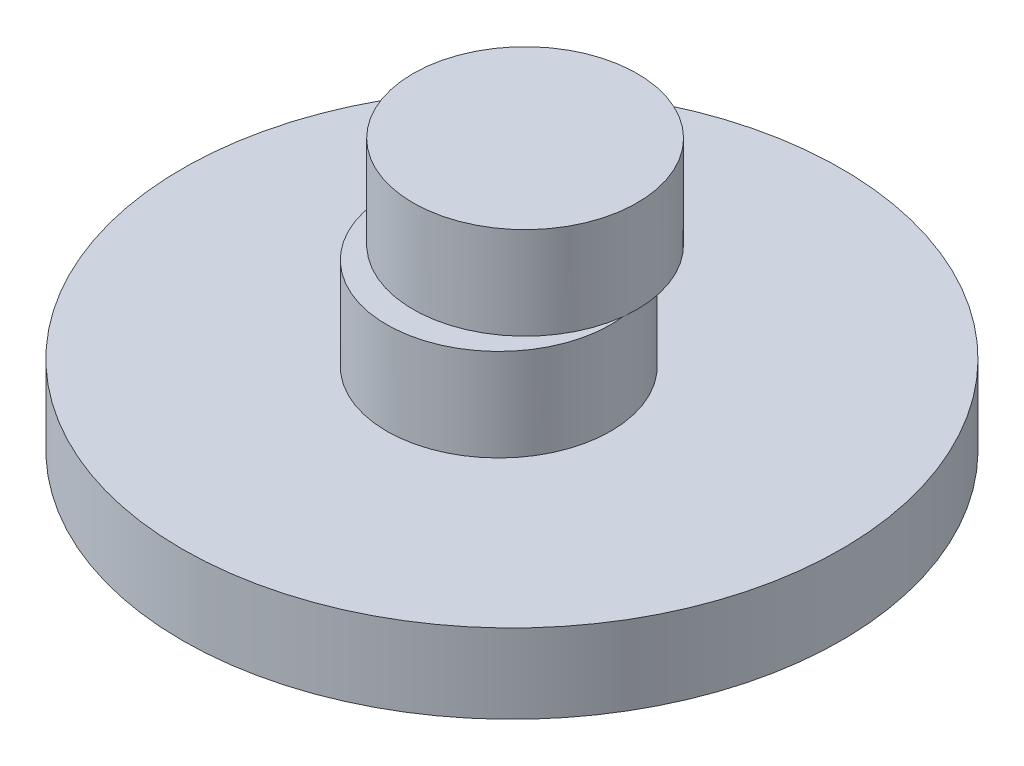
ISO-10303-21;
HEADER;
FILE_DESCRIPTION(('STEP AP214'),'2;1');
FILE_NAME('part.step','',(''),(''),'','','');
FILE_SCHEMA(('AUTOMOTIVE_DESIGN { 1 0 10303 214 1 1 1 1 }'));
ENDSEC;
DATA;
#1=APPLICATION_CONTEXT('core data for automotive mechanical design processes');
#2=APPLICATION_PROTOCOL_DEFINITION('international standard','automotive_design',2000,#1);
#3=PRODUCT_CONTEXT('',#1,'mechanical');
#4=PRODUCT('Part','Part','',(#3));
#5=PRODUCT_RELATED_PRODUCT_CATEGORY('part','',(#4));
#6=PRODUCT_DEFINITION_FORMATION('','',#4);
#7=PRODUCT_DEFINITION_CONTEXT('part definition',#1,'design');
#8=PRODUCT_DEFINITION('design','',#6,#7);
#9=PRODUCT_DEFINITION_SHAPE('','',#8);
#10=(LENGTH_UNIT() NAMED_UNIT(*) SI_UNIT(.MILLI.,.METRE.));
#11=(NAMED_UNIT(*) PLANE_ANGLE_UNIT() SI_UNIT($,.RADIAN.));
#12=(NAMED_UNIT(*) SI_UNIT($,.STERADIAN.) SOLID_ANGLE_UNIT());
#13=UNCERTAINTY_MEASURE_WITH_UNIT(LENGTH_MEASURE(1.E-05),#10,'distance_accuracy_value','');
#14=(GEOMETRIC_REPRESENTATION_CONTEXT(3) GLOBAL_UNCERTAINTY_ASSIGNED_CONTEXT((#13)) GLOBAL_UNIT_ASSIGNED_CONTEXT((#10,
#11,#12)) REPRESENTATION_CONTEXT('',''));
#15=CARTESIAN_POINT('',(0.,0.,0.));
#16=DIRECTION('',(0.,0.,1.));
#17=DIRECTION('',(1.,0.,0.));
#18=AXIS2_PLACEMENT_3D('',#15,#16,#17);
#19=CARTESIAN_POINT('',(0.,7.,0.));
#20=DIRECTION('',(0.,-1.,0.));
#21=DIRECTION('',(0.,0.,-1.));
#22=AXIS2_PLACEMENT_3D('',#19,#20,#21);
#23=CYLINDRICAL_SURFACE('',#22,4.);
#24=CARTESIAN_POINT('',(0.,0.,0.));
#25=DIRECTION('',(0.,1.,0.));
#26=DIRECTION('',(0.,0.,1.));
#27=AXIS2_PLACEMENT_3D('',#24,#25,#26);
#28=CIRCLE('',#27,4.);
#29=CARTESIAN_POINT('',(0.,0.,4.));
#30=VERTEX_POINT('',#29);
#31=EDGE_CURVE('E79',#30,#30,#28,.T.);
#32=ORIENTED_EDGE('',*,*,#31,.F.);
#33=EDGE_LOOP('',(#32));
#34=FACE_BOUND('',#33,.T.);
#35=CARTESIAN_POINT('',(0.,24.,0.));
#36=DIRECTION('',(0.,1.,0.));
#37=DIRECTION('',(0.,0.,1.));
#38=AXIS2_PLACEMENT_3D('',#35,#36,#37);
#39=CIRCLE('',#38,4.);
#40=CARTESIAN_POINT('',(0.,24.,4.));
#41=VERTEX_POINT('',#40);
#42=EDGE_CURVE('E68',#41,#41,#39,.T.);
#43=ORIENTED_EDGE('',*,*,#42,.T.);
#44=EDGE_LOOP('',(#43));
#45=FACE_BOUND('',#44,.T.);
#46=ADVANCED_FACE('F33',(#34,#45),#23,.F.);
#47=CARTESIAN_POINT('',(0.,13.,0.));
#48=DIRECTION('',(0.,1.,0.));
#49=DIRECTION('',(0.,0.,1.));
#50=AXIS2_PLACEMENT_3D('',#47,#48,#49);
#51=PLANE('',#50);
#52=CARTESIAN_POINT('',(0.,13.,0.));
#53=DIRECTION('',(0.,1.,0.));
#54=DIRECTION('',(0.,0.,1.));
#55=AXIS2_PLACEMENT_3D('',#52,#53,#54);
#56=CIRCLE('',#55,25.);
#57=CARTESIAN_POINT('',(0.,13.,25.));
#58=VERTEX_POINT('',#57);
#59=EDGE_CURVE('E76',#58,#58,#56,.T.);
#60=ORIENTED_EDGE('',*,*,#59,.T.);
#61=EDGE_LOOP('',(#60));
#62=FACE_BOUND('',#61,.T.);
#63=CARTESIAN_POINT('',(0.,13.,1.));
#64=DIRECTION('',(0.,1.,0.));
#65=DIRECTION('',(0.,0.,1.));
#66=AXIS2_PLACEMENT_3D('',#63,#64,#65);
#67=CIRCLE('',#66,8.5);
#68=CARTESIAN_POINT('',(0.,13.,9.5));
#69=VERTEX_POINT('',#68);
#70=EDGE_CURVE('E63',#69,#69,#67,.T.);
#71=ORIENTED_EDGE('',*,*,#70,.F.);
#72=EDGE_LOOP('',(#71));
#73=FACE_BOUND('',#72,.T.);
#74=ADVANCED_FACE('F93',(#62,#73),#51,.T.);
#75=CARTESIAN_POINT('',(0.,0.,0.));
#76=DIRECTION('',(0.,1.,0.));
#77=DIRECTION('',(0.,0.,1.));
#78=AXIS2_PLACEMENT_3D('',#75,#76,#77);
#79=PLANE('',#78);
#80=CARTESIAN_POINT('',(0.,0.,0.));
#81=DIRECTION('',(0.,1.,0.));
#82=DIRECTION('',(0.,0.,1.));
#83=AXIS2_PLACEMENT_3D('',#80,#81,#82);
#84=CIRCLE('',#83,8.5);
#85=CARTESIAN_POINT('',(0.,0.,8.5));
#86=VERTEX_POINT('',#85);
#87=EDGE_CURVE('E37',#86,#86,#84,.T.);
#88=ORIENTED_EDGE('',*,*,#87,.F.);
#89=EDGE_LOOP('',(#88));
#90=FACE_BOUND('',#89,.T.);
#91=ORIENTED_EDGE('',*,*,#31,.T.);
#92=EDGE_LOOP('',(#91));
#93=FACE_BOUND('',#92,.T.);
#94=ADVANCED_FACE('F90',(#90,#93),#79,.F.);
#95=CARTESIAN_POINT('',(0.,7.,0.));
#96=DIRECTION('',(0.,-1.,0.));
#97=DIRECTION('',(0.,0.,-1.));
#98=AXIS2_PLACEMENT_3D('',#95,#96,#97);
#99=CYLINDRICAL_SURFACE('',#98,8.5);
#100=CARTESIAN_POINT('',(0.,7.,0.));
#101=DIRECTION('',(0.,1.,0.));
#102=DIRECTION('',(0.,0.,1.));
#103=AXIS2_PLACEMENT_3D('',#100,#101,#102);
#104=CIRCLE('',#103,8.5);
#105=CARTESIAN_POINT('',(0.,7.,8.5));
#106=VERTEX_POINT('',#105);
#107=EDGE_CURVE('E42',#106,#106,#104,.T.);
#108=ORIENTED_EDGE('',*,*,#107,.F.);
#109=EDGE_LOOP('',(#108));
#110=FACE_BOUND('',#109,.T.);
#111=ORIENTED_EDGE('',*,*,#87,.T.);
#112=EDGE_LOOP('',(#111));
#113=FACE_BOUND('',#112,.T.);
#114=ADVANCED_FACE('F35',(#110,#113),#99,.T.);
#115=CARTESIAN_POINT('',(0.,7.,0.));
#116=DIRECTION('',(0.,1.,0.));
#117=DIRECTION('',(0.,0.,1.));
#118=AXIS2_PLACEMENT_3D('',#115,#116,#117);
#119=PLANE('',#118);
#120=ORIENTED_EDGE('',*,*,#107,.T.);
#121=EDGE_LOOP('',(#120));
#122=FACE_BOUND('',#121,.T.);
#123=CARTESIAN_POINT('',(0.,7.,0.));
#124=DIRECTION('',(0.,1.,0.));
#125=DIRECTION('',(0.,0.,1.));
#126=AXIS2_PLACEMENT_3D('',#123,#124,#125);
#127=CIRCLE('',#126,25.);
#128=CARTESIAN_POINT('',(0.,7.,25.));
#129=VERTEX_POINT('',#128);
#130=EDGE_CURVE('E60',#129,#129,#127,.T.);
#131=ORIENTED_EDGE('',*,*,#130,.F.);
#132=EDGE_LOOP('',(#131));
#133=FACE_BOUND('',#132,.T.);
#134=ADVANCED_FACE('F124',(#122,#133),#119,.F.);
#135=CARTESIAN_POINT('',(0.,13.,0.));
#136=DIRECTION('',(0.,-1.,0.));
#137=DIRECTION('',(0.,0.,-1.));
#138=AXIS2_PLACEMENT_3D('',#135,#136,#137);
#139=CYLINDRICAL_SURFACE('',#138,25.);
#140=ORIENTED_EDGE('',*,*,#59,.F.);
#141=EDGE_LOOP('',(#140));
#142=FACE_BOUND('',#141,.T.);
#143=ORIENTED_EDGE('',*,*,#130,.T.);
#144=EDGE_LOOP('',(#143));
#145=FACE_BOUND('',#144,.T.);
#146=ADVANCED_FACE('F118',(#142,#145),#139,.T.);
#147=CARTESIAN_POINT('',(0.,20.,1.));
#148=DIRECTION('',(0.,1.,0.));
#149=DIRECTION('',(0.,0.,1.));
#150=AXIS2_PLACEMENT_3D('',#147,#148,#149);
#151=PLANE('',#150);
#152=CARTESIAN_POINT('',(0.,20.,-1.));
#153=DIRECTION('',(0.,1.,0.));
#154=DIRECTION('',(0.,0.,1.));
#155=AXIS2_PLACEMENT_3D('',#152,#153,#154);
#156=CIRCLE('',#155,8.5);
#157=CARTESIAN_POINT('',(-8.44097150806707,20.,0.));
#158=VERTEX_POINT('',#157);
#159=CARTESIAN_POINT('',(8.44097150806707,20.,0.));
#160=VERTEX_POINT('',#159);
#161=EDGE_CURVE('E11',#158,#160,#156,.T.);
#162=ORIENTED_EDGE('',*,*,#161,.F.);
#163=CARTESIAN_POINT('',(0.,20.,1.));
#164=DIRECTION('',(0.,1.,0.));
#165=DIRECTION('',(0.,0.,1.));
#166=AXIS2_PLACEMENT_3D('',#163,#164,#165);
#167=CIRCLE('',#166,8.5);
#168=EDGE_CURVE('E56',#158,#160,#167,.T.);
#169=ORIENTED_EDGE('',*,*,#168,.T.);
#170=EDGE_LOOP('',(#162,#169));
#171=FACE_BOUND('',#170,.T.);
#172=ADVANCED_FACE('F62',(#171),#151,.T.);
#173=CARTESIAN_POINT('',(0.,20.,1.));
#174=DIRECTION('',(0.,-1.,0.));
#175=DIRECTION('',(0.,0.,-1.));
#176=AXIS2_PLACEMENT_3D('',#173,#174,#175);
#177=CYLINDRICAL_SURFACE('',#176,8.5);
#178=EDGE_CURVE('E53',#160,#158,#167,.T.);
#179=ORIENTED_EDGE('',*,*,#178,.F.);
#180=ORIENTED_EDGE('',*,*,#168,.F.);
#181=EDGE_LOOP('',(#179,#180));
#182=FACE_BOUND('',#181,.T.);
#183=ORIENTED_EDGE('',*,*,#70,.T.);
#184=EDGE_LOOP('',(#183));
#185=FACE_BOUND('',#184,.T.);
#186=ADVANCED_FACE('F54',(#182,#185),#177,.T.);
#187=CARTESIAN_POINT('',(0.,20.,-1.));
#188=DIRECTION('',(0.,1.,0.));
#189=DIRECTION('',(0.,0.,1.));
#190=AXIS2_PLACEMENT_3D('',#187,#188,#189);
#191=PLANE('',#190);
#192=EDGE_CURVE('E44',#160,#158,#156,.T.);
#193=ORIENTED_EDGE('',*,*,#192,.F.);
#194=ORIENTED_EDGE('',*,*,#178,.T.);
#195=EDGE_LOOP('',(#193,#194));
#196=FACE_BOUND('',#195,.T.);
#197=ADVANCED_FACE('F66',(#196),#191,.F.);
#198=CARTESIAN_POINT('',(0.,27.,-1.));
#199=DIRECTION('',(0.,1.,0.));
#200=DIRECTION('',(0.,0.,1.));
#201=AXIS2_PLACEMENT_3D('',#198,#199,#200);
#202=PLANE('',#201);
#203=CARTESIAN_POINT('',(0.,27.,-1.));
#204=DIRECTION('',(0.,1.,0.));
#205=DIRECTION('',(0.,0.,1.));
#206=AXIS2_PLACEMENT_3D('',#203,#204,#205);
#207=CIRCLE('',#206,8.5);
#208=CARTESIAN_POINT('',(0.,27.,7.5));
#209=VERTEX_POINT('',#208);
#210=EDGE_CURVE('E67',#209,#209,#207,.T.);
#211=ORIENTED_EDGE('',*,*,#210,.T.);
#212=EDGE_LOOP('',(#211));
#213=FACE_BOUND('',#212,.T.);
#214=ADVANCED_FACE('F108',(#213),#202,.T.);
#215=CARTESIAN_POINT('',(0.,27.,-1.));
#216=DIRECTION('',(0.,-1.,0.));
#217=DIRECTION('',(0.,0.,-1.));
#218=AXIS2_PLACEMENT_3D('',#215,#216,#217);
#219=CYLINDRICAL_SURFACE('',#218,8.5);
#220=ORIENTED_EDGE('',*,*,#210,.F.);
#221=EDGE_LOOP('',(#220));
#222=FACE_BOUND('',#221,.T.);
#223=ORIENTED_EDGE('',*,*,#192,.T.);
#224=ORIENTED_EDGE('',*,*,#161,.T.);
#225=EDGE_LOOP('',(#223,#224));
#226=FACE_BOUND('',#225,.T.);
#227=ADVANCED_FACE('F65',(#222,#226),#219,.T.);
#228=CARTESIAN_POINT('',(0.,24.,-1.));
#229=DIRECTION('',(0.,1.,0.));
#230=DIRECTION('',(0.,0.,1.));
#231=AXIS2_PLACEMENT_3D('',#228,#229,#230);
#232=PLANE('',#231);
#233=ORIENTED_EDGE('',*,*,#42,.F.);
#234=EDGE_LOOP('',(#233));
#235=FACE_BOUND('',#234,.T.);
#236=ADVANCED_FACE('F101',(#235),#232,.F.);
#237=CLOSED_SHELL('',(#46,#74,#94,#114,#134,#146,#172,#186,#197,#214,#227,#236));
#238=MANIFOLD_SOLID_BREP('B2',#237);
#239=ADVANCED_BREP_SHAPE_REPRESENTATION('',(#18,#238),#14);
#240=SHAPE_DEFINITION_REPRESENTATION(#9,#239);
ENDSEC;
END-ISO-10303-21;
